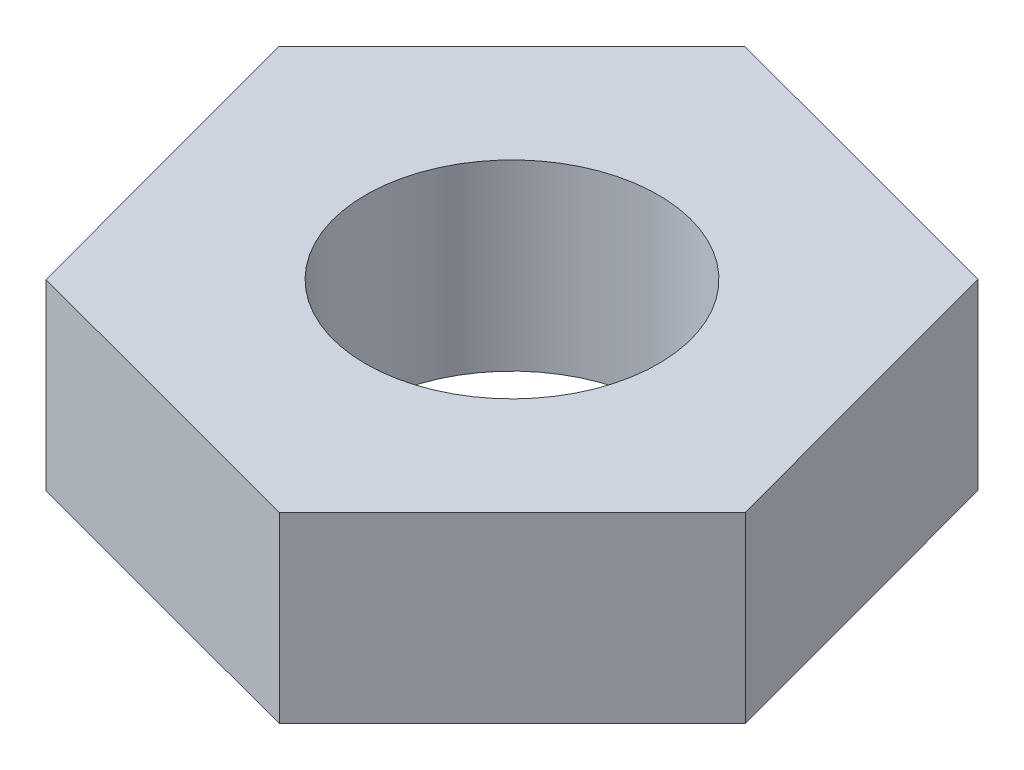
ISO-10303-21;
HEADER;
FILE_DESCRIPTION(('STEP AP214'),'2;1');
FILE_NAME('part.step','',(''),(''),'','','');
FILE_SCHEMA(('AUTOMOTIVE_DESIGN { 1 0 10303 214 1 1 1 1 }'));
ENDSEC;
DATA;
#1=APPLICATION_CONTEXT('core data for automotive mechanical design processes');
#2=APPLICATION_PROTOCOL_DEFINITION('international standard','automotive_design',2000,#1);
#3=PRODUCT_CONTEXT('',#1,'mechanical');
#4=PRODUCT('Part','Part','',(#3));
#5=PRODUCT_RELATED_PRODUCT_CATEGORY('part','',(#4));
#6=PRODUCT_DEFINITION_FORMATION('','',#4);
#7=PRODUCT_DEFINITION_CONTEXT('part definition',#1,'design');
#8=PRODUCT_DEFINITION('design','',#6,#7);
#9=PRODUCT_DEFINITION_SHAPE('','',#8);
#10=(LENGTH_UNIT() NAMED_UNIT(*) SI_UNIT(.MILLI.,.METRE.));
#11=(NAMED_UNIT(*) PLANE_ANGLE_UNIT() SI_UNIT($,.RADIAN.));
#12=(NAMED_UNIT(*) SI_UNIT($,.STERADIAN.) SOLID_ANGLE_UNIT());
#13=UNCERTAINTY_MEASURE_WITH_UNIT(LENGTH_MEASURE(1.E-05),#10,'distance_accuracy_value','');
#14=(GEOMETRIC_REPRESENTATION_CONTEXT(3) GLOBAL_UNCERTAINTY_ASSIGNED_CONTEXT((#13)) GLOBAL_UNIT_ASSIGNED_CONTEXT((#10,
#11,#12)) REPRESENTATION_CONTEXT('',''));
#15=CARTESIAN_POINT('',(0.,0.,0.));
#16=DIRECTION('',(0.,0.,1.));
#17=DIRECTION('',(1.,0.,0.));
#18=AXIS2_PLACEMENT_3D('',#15,#16,#17);
#19=CARTESIAN_POINT('',(0.,2.5,0.));
#20=DIRECTION('',(0.,1.,0.));
#21=DIRECTION('',(0.,0.,1.));
#22=AXIS2_PLACEMENT_3D('',#19,#20,#21);
#23=PLANE('',#22);
#24=DIRECTION('',(-0.706572271887541,0.,0.707640886749542));
#25=VECTOR('',#24,1.);
#26=CARTESIAN_POINT('',(-1.16883466195604,2.5,-4.3490028205337));
#27=LINE('',#26,#25);
#28=CARTESIAN_POINT('',(-1.16883466195604,2.5,-4.3490028205337));
#29=VERTEX_POINT('',#28);
#30=CARTESIAN_POINT('',(-4.35076425469039,2.5,-1.16226090018912));
#31=VERTEX_POINT('',#30);
#32=EDGE_CURVE('E131',#29,#31,#27,.T.);
#33=ORIENTED_EDGE('',*,*,#32,.T.);
#34=DIRECTION('',(0.25954884873788,0.,0.965729980439067));
#35=VECTOR('',#34,1.);
#36=CARTESIAN_POINT('',(-4.35076425469039,2.5,-1.16226090018912));
#37=LINE('',#36,#35);
#38=CARTESIAN_POINT('',(-3.18192959273434,2.5,3.18674192034459));
#39=VERTEX_POINT('',#38);
#40=EDGE_CURVE('E89',#31,#39,#37,.T.);
#41=ORIENTED_EDGE('',*,*,#40,.T.);
#42=DIRECTION('',(0.966121120625421,0.,0.258089093689525));
#43=VECTOR('',#42,1.);
#44=CARTESIAN_POINT('',(-3.18192959273434,2.5,3.18674192034459));
#45=LINE('',#44,#43);
#46=CARTESIAN_POINT('',(1.16883466195604,2.5,4.3490028205337));
#47=VERTEX_POINT('',#46);
#48=EDGE_CURVE('E102',#39,#47,#45,.T.);
#49=ORIENTED_EDGE('',*,*,#48,.T.);
#50=DIRECTION('',(0.706572271887541,0.,-0.707640886749542));
#51=VECTOR('',#50,1.);
#52=CARTESIAN_POINT('',(1.16883466195604,2.5,4.3490028205337));
#53=LINE('',#52,#51);
#54=CARTESIAN_POINT('',(4.35076425469039,2.5,1.16226090018912));
#55=VERTEX_POINT('',#54);
#56=EDGE_CURVE('E96',#47,#55,#53,.T.);
#57=ORIENTED_EDGE('',*,*,#56,.T.);
#58=DIRECTION('',(-0.25954884873788,0.,-0.965729980439067));
#59=VECTOR('',#58,1.);
#60=CARTESIAN_POINT('',(4.35076425469039,2.5,1.16226090018912));
#61=LINE('',#60,#59);
#62=CARTESIAN_POINT('',(3.18192959273434,2.5,-3.18674192034459));
#63=VERTEX_POINT('',#62);
#64=EDGE_CURVE('E100',#55,#63,#61,.T.);
#65=ORIENTED_EDGE('',*,*,#64,.T.);
#66=DIRECTION('',(-0.966121120625421,0.,-0.258089093689525));
#67=VECTOR('',#66,1.);
#68=CARTESIAN_POINT('',(3.18192959273434,2.5,-3.18674192034459));
#69=LINE('',#68,#67);
#70=EDGE_CURVE('E52',#63,#29,#69,.T.);
#71=ORIENTED_EDGE('',*,*,#70,.T.);
#72=EDGE_LOOP('',(#33,#41,#49,#57,#65,#71));
#73=FACE_BOUND('',#72,.T.);
#74=CARTESIAN_POINT('',(0.,2.5,0.));
#75=DIRECTION('',(0.,1.,0.));
#76=DIRECTION('',(0.,0.,1.));
#77=AXIS2_PLACEMENT_3D('',#74,#75,#76);
#78=CIRCLE('',#77,2.);
#79=CARTESIAN_POINT('',(0.,2.5,2.));
#80=VERTEX_POINT('',#79);
#81=EDGE_CURVE('E124',#80,#80,#78,.T.);
#82=ORIENTED_EDGE('',*,*,#81,.F.);
#83=EDGE_LOOP('',(#82));
#84=FACE_BOUND('',#83,.T.);
#85=ADVANCED_FACE('F35',(#73,#84),#23,.T.);
#86=CARTESIAN_POINT('',(0.,0.,0.));
#87=DIRECTION('',(0.,1.,0.));
#88=DIRECTION('',(0.,0.,1.));
#89=AXIS2_PLACEMENT_3D('',#86,#87,#88);
#90=PLANE('',#89);
#91=DIRECTION('',(-0.706572271887541,0.,0.707640886749542));
#92=VECTOR('',#91,1.);
#93=CARTESIAN_POINT('',(-1.16883466195604,0.,-4.3490028205337));
#94=LINE('',#93,#92);
#95=CARTESIAN_POINT('',(-1.16883466195604,0.,-4.3490028205337));
#96=VERTEX_POINT('',#95);
#97=CARTESIAN_POINT('',(-4.35076425469039,0.,-1.16226090018912));
#98=VERTEX_POINT('',#97);
#99=EDGE_CURVE('E120',#96,#98,#94,.T.);
#100=ORIENTED_EDGE('',*,*,#99,.F.);
#101=DIRECTION('',(-0.966121120625421,0.,-0.258089093689525));
#102=VECTOR('',#101,1.);
#103=CARTESIAN_POINT('',(3.18192959273434,0.,-3.18674192034459));
#104=LINE('',#103,#102);
#105=CARTESIAN_POINT('',(3.18192959273434,0.,-3.18674192034459));
#106=VERTEX_POINT('',#105);
#107=EDGE_CURVE('E81',#106,#96,#104,.T.);
#108=ORIENTED_EDGE('',*,*,#107,.F.);
#109=DIRECTION('',(-0.25954884873788,0.,-0.965729980439067));
#110=VECTOR('',#109,1.);
#111=CARTESIAN_POINT('',(4.35076425469039,0.,1.16226090018912));
#112=LINE('',#111,#110);
#113=CARTESIAN_POINT('',(4.35076425469039,0.,1.16226090018912));
#114=VERTEX_POINT('',#113);
#115=EDGE_CURVE('E75',#114,#106,#112,.T.);
#116=ORIENTED_EDGE('',*,*,#115,.F.);
#117=DIRECTION('',(0.706572271887541,0.,-0.707640886749542));
#118=VECTOR('',#117,1.);
#119=CARTESIAN_POINT('',(1.16883466195604,0.,4.3490028205337));
#120=LINE('',#119,#118);
#121=CARTESIAN_POINT('',(1.16883466195604,0.,4.3490028205337));
#122=VERTEX_POINT('',#121);
#123=EDGE_CURVE('E110',#122,#114,#120,.T.);
#124=ORIENTED_EDGE('',*,*,#123,.F.);
#125=DIRECTION('',(0.966121120625421,0.,0.258089093689525));
#126=VECTOR('',#125,1.);
#127=CARTESIAN_POINT('',(-3.18192959273434,0.,3.18674192034459));
#128=LINE('',#127,#126);
#129=CARTESIAN_POINT('',(-3.18192959273434,0.,3.18674192034459));
#130=VERTEX_POINT('',#129);
#131=EDGE_CURVE('E126',#130,#122,#128,.T.);
#132=ORIENTED_EDGE('',*,*,#131,.F.);
#133=DIRECTION('',(0.25954884873788,0.,0.965729980439067));
#134=VECTOR('',#133,1.);
#135=CARTESIAN_POINT('',(-4.35076425469039,0.,-1.16226090018912));
#136=LINE('',#135,#134);
#137=EDGE_CURVE('E123',#98,#130,#136,.T.);
#138=ORIENTED_EDGE('',*,*,#137,.F.);
#139=EDGE_LOOP('',(#100,#108,#116,#124,#132,#138));
#140=FACE_BOUND('',#139,.T.);
#141=CARTESIAN_POINT('',(0.,0.,0.));
#142=DIRECTION('',(0.,1.,0.));
#143=DIRECTION('',(0.,0.,1.));
#144=AXIS2_PLACEMENT_3D('',#141,#142,#143);
#145=CIRCLE('',#144,2.);
#146=CARTESIAN_POINT('',(0.,0.,2.));
#147=VERTEX_POINT('',#146);
#148=EDGE_CURVE('E224',#147,#147,#145,.T.);
#149=ORIENTED_EDGE('',*,*,#148,.T.);
#150=EDGE_LOOP('',(#149));
#151=FACE_BOUND('',#150,.T.);
#152=ADVANCED_FACE('F140',(#140,#151),#90,.F.);
#153=CARTESIAN_POINT('',(-1.16883466195604,2.5,-4.3490028205337));
#154=DIRECTION('',(0.707640886749542,0.,0.706572271887541));
#155=DIRECTION('',(0.706572271887541,0.,-0.707640886749542));
#156=AXIS2_PLACEMENT_3D('',#153,#154,#155);
#157=PLANE('',#156);
#158=ORIENTED_EDGE('',*,*,#99,.T.);
#159=DIRECTION('',(0.,-1.,0.));
#160=VECTOR('',#159,1.);
#161=CARTESIAN_POINT('',(-4.35076425469039,2.5,-1.16226090018912));
#162=LINE('',#161,#160);
#163=EDGE_CURVE('E11',#31,#98,#162,.T.);
#164=ORIENTED_EDGE('',*,*,#163,.F.);
#165=ORIENTED_EDGE('',*,*,#32,.F.);
#166=DIRECTION('',(0.,-1.,0.));
#167=VECTOR('',#166,1.);
#168=CARTESIAN_POINT('',(-1.16883466195604,2.5,-4.3490028205337));
#169=LINE('',#168,#167);
#170=EDGE_CURVE('E116',#29,#96,#169,.T.);
#171=ORIENTED_EDGE('',*,*,#170,.T.);
#172=EDGE_LOOP('',(#158,#164,#165,#171));
#173=FACE_BOUND('',#172,.T.);
#174=ADVANCED_FACE('F37',(#173),#157,.F.);
#175=CARTESIAN_POINT('',(-4.35076425469039,2.5,-1.16226090018912));
#176=DIRECTION('',(0.965729980439067,0.,-0.25954884873788));
#177=DIRECTION('',(-0.25954884873788,0.,-0.965729980439067));
#178=AXIS2_PLACEMENT_3D('',#175,#176,#177);
#179=PLANE('',#178);
#180=ORIENTED_EDGE('',*,*,#137,.T.);
#181=DIRECTION('',(0.,-1.,0.));
#182=VECTOR('',#181,1.);
#183=CARTESIAN_POINT('',(-3.18192959273434,2.5,3.18674192034459));
#184=LINE('',#183,#182);
#185=EDGE_CURVE('E44',#39,#130,#184,.T.);
#186=ORIENTED_EDGE('',*,*,#185,.F.);
#187=ORIENTED_EDGE('',*,*,#40,.F.);
#188=ORIENTED_EDGE('',*,*,#163,.T.);
#189=EDGE_LOOP('',(#180,#186,#187,#188));
#190=FACE_BOUND('',#189,.T.);
#191=ADVANCED_FACE('F165',(#190),#179,.F.);
#192=CARTESIAN_POINT('',(-3.18192959273434,2.5,3.18674192034459));
#193=DIRECTION('',(0.258089093689525,0.,-0.966121120625421));
#194=DIRECTION('',(-0.966121120625421,0.,-0.258089093689525));
#195=AXIS2_PLACEMENT_3D('',#192,#193,#194);
#196=PLANE('',#195);
#197=ORIENTED_EDGE('',*,*,#131,.T.);
#198=DIRECTION('',(0.,-1.,0.));
#199=VECTOR('',#198,1.);
#200=CARTESIAN_POINT('',(1.16883466195604,2.5,4.3490028205337));
#201=LINE('',#200,#199);
#202=EDGE_CURVE('E111',#47,#122,#201,.T.);
#203=ORIENTED_EDGE('',*,*,#202,.F.);
#204=ORIENTED_EDGE('',*,*,#48,.F.);
#205=ORIENTED_EDGE('',*,*,#185,.T.);
#206=EDGE_LOOP('',(#197,#203,#204,#205));
#207=FACE_BOUND('',#206,.T.);
#208=ADVANCED_FACE('F137',(#207),#196,.F.);
#209=CARTESIAN_POINT('',(1.16883466195604,2.5,4.3490028205337));
#210=DIRECTION('',(-0.707640886749542,0.,-0.706572271887541));
#211=DIRECTION('',(-0.706572271887541,0.,0.707640886749543));
#212=AXIS2_PLACEMENT_3D('',#209,#210,#211);
#213=PLANE('',#212);
#214=ORIENTED_EDGE('',*,*,#123,.T.);
#215=DIRECTION('',(0.,-1.,0.));
#216=VECTOR('',#215,1.);
#217=CARTESIAN_POINT('',(4.35076425469039,2.5,1.16226090018912));
#218=LINE('',#217,#216);
#219=EDGE_CURVE('E107',#55,#114,#218,.T.);
#220=ORIENTED_EDGE('',*,*,#219,.F.);
#221=ORIENTED_EDGE('',*,*,#56,.F.);
#222=ORIENTED_EDGE('',*,*,#202,.T.);
#223=EDGE_LOOP('',(#214,#220,#221,#222));
#224=FACE_BOUND('',#223,.T.);
#225=ADVANCED_FACE('F108',(#224),#213,.F.);
#226=CARTESIAN_POINT('',(4.35076425469039,2.5,1.16226090018912));
#227=DIRECTION('',(-0.965729980439067,0.,0.259548848737879));
#228=DIRECTION('',(0.259548848737879,0.,0.965729980439067));
#229=AXIS2_PLACEMENT_3D('',#226,#227,#228);
#230=PLANE('',#229);
#231=ORIENTED_EDGE('',*,*,#115,.T.);
#232=DIRECTION('',(0.,-1.,0.));
#233=VECTOR('',#232,1.);
#234=CARTESIAN_POINT('',(3.18192959273434,2.5,-3.18674192034459));
#235=LINE('',#234,#233);
#236=EDGE_CURVE('E112',#63,#106,#235,.T.);
#237=ORIENTED_EDGE('',*,*,#236,.F.);
#238=ORIENTED_EDGE('',*,*,#64,.F.);
#239=ORIENTED_EDGE('',*,*,#219,.T.);
#240=EDGE_LOOP('',(#231,#237,#238,#239));
#241=FACE_BOUND('',#240,.T.);
#242=ADVANCED_FACE('F114',(#241),#230,.F.);
#243=CARTESIAN_POINT('',(3.18192959273434,2.5,-3.18674192034459));
#244=DIRECTION('',(-0.258089093689525,0.,0.966121120625421));
#245=DIRECTION('',(0.966121120625421,0.,0.258089093689525));
#246=AXIS2_PLACEMENT_3D('',#243,#244,#245);
#247=PLANE('',#246);
#248=ORIENTED_EDGE('',*,*,#107,.T.);
#249=ORIENTED_EDGE('',*,*,#170,.F.);
#250=ORIENTED_EDGE('',*,*,#70,.F.);
#251=ORIENTED_EDGE('',*,*,#236,.T.);
#252=EDGE_LOOP('',(#248,#249,#250,#251));
#253=FACE_BOUND('',#252,.T.);
#254=ADVANCED_FACE('F145',(#253),#247,.F.);
#255=CARTESIAN_POINT('',(0.,2.5,0.));
#256=DIRECTION('',(0.,-1.,0.));
#257=DIRECTION('',(0.,0.,-1.));
#258=AXIS2_PLACEMENT_3D('',#255,#256,#257);
#259=CYLINDRICAL_SURFACE('',#258,2.);
#260=ORIENTED_EDGE('',*,*,#81,.T.);
#261=EDGE_LOOP('',(#260));
#262=FACE_BOUND('',#261,.T.);
#263=ORIENTED_EDGE('',*,*,#148,.F.);
#264=EDGE_LOOP('',(#263));
#265=FACE_BOUND('',#264,.T.);
#266=ADVANCED_FACE('F147',(#262,#265),#259,.F.);
#267=CLOSED_SHELL('',(#85,#152,#174,#191,#208,#225,#242,#254,#266));
#268=MANIFOLD_SOLID_BREP('B2',#267);
#269=ADVANCED_BREP_SHAPE_REPRESENTATION('',(#18,#268),#14);
#270=SHAPE_DEFINITION_REPRESENTATION(#9,#269);
ENDSEC;
END-ISO-10303-21;
